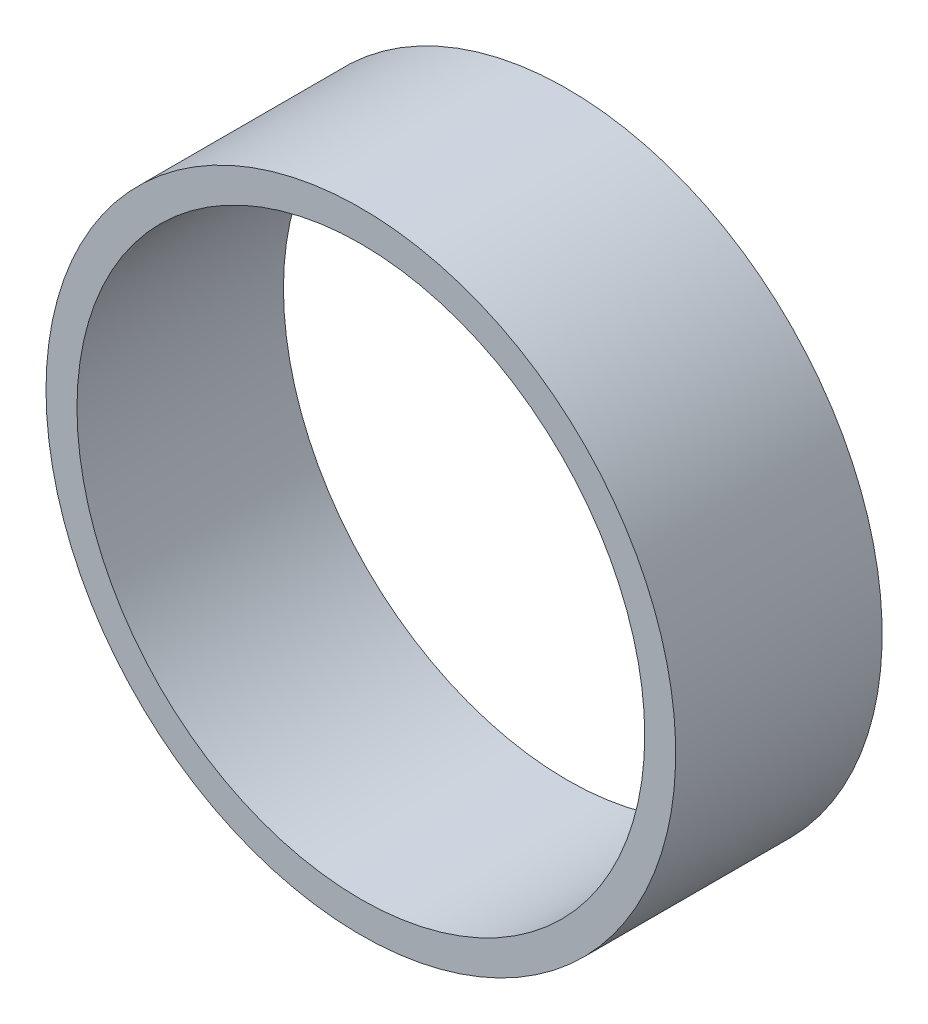
ISO-10303-21;
HEADER;
FILE_DESCRIPTION(('STEP AP214'),'2;1');
FILE_NAME('part.step','',(''),(''),'','','');
FILE_SCHEMA(('AUTOMOTIVE_DESIGN { 1 0 10303 214 1 1 1 1 }'));
ENDSEC;
DATA;
#1=APPLICATION_CONTEXT('core data for automotive mechanical design processes');
#2=APPLICATION_PROTOCOL_DEFINITION('international standard','automotive_design',2000,#1);
#3=PRODUCT_CONTEXT('',#1,'mechanical');
#4=PRODUCT('Part','Part','',(#3));
#5=PRODUCT_RELATED_PRODUCT_CATEGORY('part','',(#4));
#6=PRODUCT_DEFINITION_FORMATION('','',#4);
#7=PRODUCT_DEFINITION_CONTEXT('part definition',#1,'design');
#8=PRODUCT_DEFINITION('design','',#6,#7);
#9=PRODUCT_DEFINITION_SHAPE('','',#8);
#10=(LENGTH_UNIT() NAMED_UNIT(*) SI_UNIT(.MILLI.,.METRE.));
#11=(NAMED_UNIT(*) PLANE_ANGLE_UNIT() SI_UNIT($,.RADIAN.));
#12=(NAMED_UNIT(*) SI_UNIT($,.STERADIAN.) SOLID_ANGLE_UNIT());
#13=UNCERTAINTY_MEASURE_WITH_UNIT(LENGTH_MEASURE(1.E-05),#10,'distance_accuracy_value','');
#14=(GEOMETRIC_REPRESENTATION_CONTEXT(3) GLOBAL_UNCERTAINTY_ASSIGNED_CONTEXT((#13)) GLOBAL_UNIT_ASSIGNED_CONTEXT((#10,
#11,#12)) REPRESENTATION_CONTEXT('',''));
#15=CARTESIAN_POINT('',(0.,0.,0.));
#16=DIRECTION('',(0.,0.,1.));
#17=DIRECTION('',(1.,0.,0.));
#18=AXIS2_PLACEMENT_3D('',#15,#16,#17);
#19=CARTESIAN_POINT('',(0.,0.,20.));
#20=DIRECTION('',(0.,0.,0.999999999999998));
#21=DIRECTION('',(1.,0.,0.));
#22=AXIS2_PLACEMENT_3D('',#19,#20,#21);
#23=PLANE('',#22);
#24=CARTESIAN_POINT('',(0.,0.,20.));
#25=DIRECTION('',(0.,0.,0.999999999999998));
#26=DIRECTION('',(1.,0.,0.));
#27=AXIS2_PLACEMENT_3D('',#24,#25,#26);
#28=CIRCLE('',#27,30.5);
#29=CARTESIAN_POINT('',(-30.5000000000001,0.,20.));
#30=VERTEX_POINT('',#29);
#31=EDGE_CURVE('E12',#30,#30,#28,.T.);
#32=ORIENTED_EDGE('',*,*,#31,.T.);
#33=EDGE_LOOP('',(#32));
#34=FACE_BOUND('',#33,.T.);
#35=CARTESIAN_POINT('',(0.,0.,20.));
#36=DIRECTION('',(0.,0.,0.999999999999998));
#37=DIRECTION('',(1.,0.,0.));
#38=AXIS2_PLACEMENT_3D('',#35,#36,#37);
#39=CIRCLE('',#38,27.5);
#40=CARTESIAN_POINT('',(-27.5000000000001,0.,20.));
#41=VERTEX_POINT('',#40);
#42=EDGE_CURVE('E56',#41,#41,#39,.T.);
#43=ORIENTED_EDGE('',*,*,#42,.F.);
#44=EDGE_LOOP('',(#43));
#45=FACE_BOUND('',#44,.T.);
#46=ADVANCED_FACE('F45',(#34,#45),#23,.T.);
#47=CARTESIAN_POINT('',(0.,0.,0.));
#48=DIRECTION('',(0.,0.,0.999999999999998));
#49=DIRECTION('',(1.,0.,0.));
#50=AXIS2_PLACEMENT_3D('',#47,#48,#49);
#51=PLANE('',#50);
#52=CARTESIAN_POINT('',(0.,0.,0.));
#53=DIRECTION('',(0.,0.,0.999999999999998));
#54=DIRECTION('',(1.,0.,0.));
#55=AXIS2_PLACEMENT_3D('',#52,#53,#54);
#56=CIRCLE('',#55,30.5);
#57=CARTESIAN_POINT('',(-30.5000000000001,0.,0.));
#58=VERTEX_POINT('',#57);
#59=EDGE_CURVE('E49',#58,#58,#56,.T.);
#60=ORIENTED_EDGE('',*,*,#59,.F.);
#61=EDGE_LOOP('',(#60));
#62=FACE_BOUND('',#61,.T.);
#63=CARTESIAN_POINT('',(0.,0.,0.));
#64=DIRECTION('',(0.,0.,0.999999999999998));
#65=DIRECTION('',(1.,0.,0.));
#66=AXIS2_PLACEMENT_3D('',#63,#64,#65);
#67=CIRCLE('',#66,27.5);
#68=CARTESIAN_POINT('',(-27.5000000000001,0.,0.));
#69=VERTEX_POINT('',#68);
#70=EDGE_CURVE('E58',#69,#69,#67,.T.);
#71=ORIENTED_EDGE('',*,*,#70,.T.);
#72=EDGE_LOOP('',(#71));
#73=FACE_BOUND('',#72,.T.);
#74=ADVANCED_FACE('F68',(#62,#73),#51,.F.);
#75=CARTESIAN_POINT('',(0.,0.,20.));
#76=DIRECTION('',(0.,0.,-0.999999999999998));
#77=DIRECTION('',(-1.,0.,0.));
#78=AXIS2_PLACEMENT_3D('',#75,#76,#77);
#79=CYLINDRICAL_SURFACE('',#78,30.5);
#80=CARTESIAN_POINT('',(-30.5000000000001,0.,20.));
#81=CARTESIAN_POINT('',(-30.5000000000001,0.,19.7916666666667));
#82=CARTESIAN_POINT('',(-30.5000000000001,0.,19.5833333333333));
#83=CARTESIAN_POINT('',(-30.5000000000001,0.,19.1666666666667));
#84=CARTESIAN_POINT('',(-30.5000000000001,0.,18.9583333333333));
#85=CARTESIAN_POINT('',(-30.5000000000001,0.,18.5416666666667));
#86=CARTESIAN_POINT('',(-30.5000000000001,0.,18.3333333333333));
#87=CARTESIAN_POINT('',(-30.5000000000001,0.,17.9166666666667));
#88=CARTESIAN_POINT('',(-30.5000000000001,0.,17.7083333333333));
#89=CARTESIAN_POINT('',(-30.5000000000001,0.,17.2916666666667));
#90=CARTESIAN_POINT('',(-30.5000000000001,0.,17.0833333333333));
#91=CARTESIAN_POINT('',(-30.5000000000001,0.,16.6666666666667));
#92=CARTESIAN_POINT('',(-30.5000000000001,0.,16.4583333333333));
#93=CARTESIAN_POINT('',(-30.5000000000001,0.,16.0416666666667));
#94=CARTESIAN_POINT('',(-30.5000000000001,0.,15.8333333333333));
#95=CARTESIAN_POINT('',(-30.5000000000001,0.,15.4166666666667));
#96=CARTESIAN_POINT('',(-30.5000000000001,0.,15.2083333333333));
#97=CARTESIAN_POINT('',(-30.5000000000001,0.,14.7916666666667));
#98=CARTESIAN_POINT('',(-30.5000000000001,0.,14.5833333333333));
#99=CARTESIAN_POINT('',(-30.5000000000001,0.,14.1666666666667));
#100=CARTESIAN_POINT('',(-30.5000000000001,0.,13.9583333333333));
#101=CARTESIAN_POINT('',(-30.5000000000001,0.,13.5416666666667));
#102=CARTESIAN_POINT('',(-30.5000000000001,0.,13.3333333333333));
#103=CARTESIAN_POINT('',(-30.5000000000001,0.,12.9166666666667));
#104=CARTESIAN_POINT('',(-30.5000000000001,0.,12.7083333333333));
#105=CARTESIAN_POINT('',(-30.5000000000001,0.,12.2916666666667));
#106=CARTESIAN_POINT('',(-30.5000000000001,0.,12.0833333333333));
#107=CARTESIAN_POINT('',(-30.5000000000001,0.,11.6666666666667));
#108=CARTESIAN_POINT('',(-30.5000000000001,0.,11.4583333333333));
#109=CARTESIAN_POINT('',(-30.5000000000001,0.,11.0416666666667));
#110=CARTESIAN_POINT('',(-30.5000000000001,0.,10.8333333333333));
#111=CARTESIAN_POINT('',(-30.5000000000001,0.,10.4166666666667));
#112=CARTESIAN_POINT('',(-30.5000000000001,0.,10.2083333333333));
#113=CARTESIAN_POINT('',(-30.5000000000001,0.,9.79166666666666));
#114=CARTESIAN_POINT('',(-30.5000000000001,0.,9.58333333333333));
#115=CARTESIAN_POINT('',(-30.5000000000001,0.,9.16666666666666));
#116=CARTESIAN_POINT('',(-30.5000000000001,0.,8.95833333333333));
#117=CARTESIAN_POINT('',(-30.5000000000001,0.,8.54166666666666));
#118=CARTESIAN_POINT('',(-30.5000000000001,0.,8.33333333333333));
#119=CARTESIAN_POINT('',(-30.5000000000001,0.,7.91666666666666));
#120=CARTESIAN_POINT('',(-30.5000000000001,0.,7.70833333333333));
#121=CARTESIAN_POINT('',(-30.5000000000001,0.,7.29166666666666));
#122=CARTESIAN_POINT('',(-30.5000000000001,0.,7.08333333333333));
#123=CARTESIAN_POINT('',(-30.5000000000001,0.,6.66666666666666));
#124=CARTESIAN_POINT('',(-30.5000000000001,0.,6.45833333333333));
#125=CARTESIAN_POINT('',(-30.5000000000001,0.,6.04166666666666));
#126=CARTESIAN_POINT('',(-30.5000000000001,0.,5.83333333333333));
#127=CARTESIAN_POINT('',(-30.5000000000001,0.,5.41666666666666));
#128=CARTESIAN_POINT('',(-30.5000000000001,0.,5.20833333333333));
#129=CARTESIAN_POINT('',(-30.5000000000001,0.,4.79166666666666));
#130=CARTESIAN_POINT('',(-30.5000000000001,0.,4.58333333333333));
#131=CARTESIAN_POINT('',(-30.5000000000001,0.,4.16666666666666));
#132=CARTESIAN_POINT('',(-30.5000000000001,0.,3.95833333333333));
#133=CARTESIAN_POINT('',(-30.5000000000001,0.,3.54166666666666));
#134=CARTESIAN_POINT('',(-30.5000000000001,0.,3.33333333333333));
#135=CARTESIAN_POINT('',(-30.5000000000001,0.,2.91666666666666));
#136=CARTESIAN_POINT('',(-30.5000000000001,0.,2.70833333333333));
#137=CARTESIAN_POINT('',(-30.5000000000001,0.,2.29166666666666));
#138=CARTESIAN_POINT('',(-30.5000000000001,0.,2.08333333333333));
#139=CARTESIAN_POINT('',(-30.5000000000001,0.,1.66666666666666));
#140=CARTESIAN_POINT('',(-30.5000000000001,0.,1.45833333333333));
#141=CARTESIAN_POINT('',(-30.5000000000001,0.,1.04166666666666));
#142=CARTESIAN_POINT('',(-30.5000000000001,0.,0.833333333333331));
#143=CARTESIAN_POINT('',(-30.5000000000001,0.,0.416666666666665));
#144=CARTESIAN_POINT('',(-30.5000000000001,0.,0.208333333333333));
#145=CARTESIAN_POINT('',(-30.5000000000001,0.,0.));
#146=B_SPLINE_CURVE_WITH_KNOTS('',3,(#80,#81,#82,#83,#84,#85,#86,#87,#88,#89,#90,#91,#92,#93,
#94,#95,#96,#97,#98,#99,#100,#101,#102,#103,#104,#105,#106,#107,#108,#109,#110,#111,#112,#113,
#114,#115,#116,#117,#118,#119,#120,#121,#122,#123,#124,#125,#126,#127,#128,#129,#130,#131,#132,
#133,#134,#135,#136,#137,#138,#139,#140,#141,#142,#143,#144,#145),.UNSPECIFIED.,.F.,.F.,(4,2,2,
2,2,2,2,2,2,2,2,2,2,2,2,2,2,2,2,2,2,2,2,2,2,2,2,2,2,2,2,2,4),(0.,0.624999999999997,1.25,1.875,
2.5,3.125,3.75,4.375,4.99999999999999,5.62499999999999,6.25,6.87499999999999,7.49999999999999,
8.12499999999999,8.74999999999999,9.37499999999999,9.99999999999999,10.625,11.25,11.875,12.5,
13.125,13.75,14.375,15.,15.625,16.25,16.875,17.5,18.125,18.75,19.375,20.),.UNSPECIFIED.);
#147=EDGE_CURVE('BSEAM47',#30,#58,#146,.T.);
#148=ORIENTED_EDGE('',*,*,#31,.F.);
#149=ORIENTED_EDGE('',*,*,#59,.T.);
#150=ORIENTED_EDGE('',*,*,#147,.T.);
#151=ORIENTED_EDGE('',*,*,#147,.F.);
#152=EDGE_LOOP('',(#148,#150,#149,#151));
#153=FACE_BOUND('',#152,.T.);
#154=ADVANCED_FACE('F47',(#153),#79,.T.);
#155=CARTESIAN_POINT('',(0.,0.,20.));
#156=DIRECTION('',(0.,0.,-0.999999999999998));
#157=DIRECTION('',(-1.,0.,0.));
#158=AXIS2_PLACEMENT_3D('',#155,#156,#157);
#159=CYLINDRICAL_SURFACE('',#158,27.5);
#160=CARTESIAN_POINT('',(-27.5000000000001,0.,20.));
#161=CARTESIAN_POINT('',(-27.5000000000001,0.,19.7916666666667));
#162=CARTESIAN_POINT('',(-27.5000000000001,0.,19.5833333333333));
#163=CARTESIAN_POINT('',(-27.5000000000001,0.,19.1666666666667));
#164=CARTESIAN_POINT('',(-27.5000000000001,0.,18.9583333333333));
#165=CARTESIAN_POINT('',(-27.5000000000001,0.,18.5416666666667));
#166=CARTESIAN_POINT('',(-27.5000000000001,0.,18.3333333333333));
#167=CARTESIAN_POINT('',(-27.5000000000001,0.,17.9166666666667));
#168=CARTESIAN_POINT('',(-27.5000000000001,0.,17.7083333333333));
#169=CARTESIAN_POINT('',(-27.5000000000001,0.,17.2916666666667));
#170=CARTESIAN_POINT('',(-27.5000000000001,0.,17.0833333333333));
#171=CARTESIAN_POINT('',(-27.5000000000001,0.,16.6666666666667));
#172=CARTESIAN_POINT('',(-27.5000000000001,0.,16.4583333333333));
#173=CARTESIAN_POINT('',(-27.5000000000001,0.,16.0416666666667));
#174=CARTESIAN_POINT('',(-27.5000000000001,0.,15.8333333333333));
#175=CARTESIAN_POINT('',(-27.5000000000001,0.,15.4166666666667));
#176=CARTESIAN_POINT('',(-27.5000000000001,0.,15.2083333333333));
#177=CARTESIAN_POINT('',(-27.5000000000001,0.,14.7916666666667));
#178=CARTESIAN_POINT('',(-27.5000000000001,0.,14.5833333333333));
#179=CARTESIAN_POINT('',(-27.5000000000001,0.,14.1666666666667));
#180=CARTESIAN_POINT('',(-27.5000000000001,0.,13.9583333333333));
#181=CARTESIAN_POINT('',(-27.5000000000001,0.,13.5416666666667));
#182=CARTESIAN_POINT('',(-27.5000000000001,0.,13.3333333333333));
#183=CARTESIAN_POINT('',(-27.5000000000001,0.,12.9166666666667));
#184=CARTESIAN_POINT('',(-27.5000000000001,0.,12.7083333333333));
#185=CARTESIAN_POINT('',(-27.5000000000001,0.,12.2916666666667));
#186=CARTESIAN_POINT('',(-27.5000000000001,0.,12.0833333333333));
#187=CARTESIAN_POINT('',(-27.5000000000001,0.,11.6666666666667));
#188=CARTESIAN_POINT('',(-27.5000000000001,0.,11.4583333333333));
#189=CARTESIAN_POINT('',(-27.5000000000001,0.,11.0416666666667));
#190=CARTESIAN_POINT('',(-27.5000000000001,0.,10.8333333333333));
#191=CARTESIAN_POINT('',(-27.5000000000001,0.,10.4166666666667));
#192=CARTESIAN_POINT('',(-27.5000000000001,0.,10.2083333333333));
#193=CARTESIAN_POINT('',(-27.5000000000001,0.,9.79166666666666));
#194=CARTESIAN_POINT('',(-27.5000000000001,0.,9.58333333333333));
#195=CARTESIAN_POINT('',(-27.5000000000001,0.,9.16666666666666));
#196=CARTESIAN_POINT('',(-27.5000000000001,0.,8.95833333333333));
#197=CARTESIAN_POINT('',(-27.5000000000001,0.,8.54166666666666));
#198=CARTESIAN_POINT('',(-27.5000000000001,0.,8.33333333333333));
#199=CARTESIAN_POINT('',(-27.5000000000001,0.,7.91666666666666));
#200=CARTESIAN_POINT('',(-27.5000000000001,0.,7.70833333333333));
#201=CARTESIAN_POINT('',(-27.5000000000001,0.,7.29166666666666));
#202=CARTESIAN_POINT('',(-27.5000000000001,0.,7.08333333333333));
#203=CARTESIAN_POINT('',(-27.5000000000001,0.,6.66666666666666));
#204=CARTESIAN_POINT('',(-27.5000000000001,0.,6.45833333333333));
#205=CARTESIAN_POINT('',(-27.5000000000001,0.,6.04166666666666));
#206=CARTESIAN_POINT('',(-27.5000000000001,0.,5.83333333333333));
#207=CARTESIAN_POINT('',(-27.5000000000001,0.,5.41666666666666));
#208=CARTESIAN_POINT('',(-27.5000000000001,0.,5.20833333333333));
#209=CARTESIAN_POINT('',(-27.5000000000001,0.,4.79166666666666));
#210=CARTESIAN_POINT('',(-27.5000000000001,0.,4.58333333333333));
#211=CARTESIAN_POINT('',(-27.5000000000001,0.,4.16666666666666));
#212=CARTESIAN_POINT('',(-27.5000000000001,0.,3.95833333333333));
#213=CARTESIAN_POINT('',(-27.5000000000001,0.,3.54166666666666));
#214=CARTESIAN_POINT('',(-27.5000000000001,0.,3.33333333333333));
#215=CARTESIAN_POINT('',(-27.5000000000001,0.,2.91666666666666));
#216=CARTESIAN_POINT('',(-27.5000000000001,0.,2.70833333333333));
#217=CARTESIAN_POINT('',(-27.5000000000001,0.,2.29166666666666));
#218=CARTESIAN_POINT('',(-27.5000000000001,0.,2.08333333333333));
#219=CARTESIAN_POINT('',(-27.5000000000001,0.,1.66666666666666));
#220=CARTESIAN_POINT('',(-27.5000000000001,0.,1.45833333333333));
#221=CARTESIAN_POINT('',(-27.5000000000001,0.,1.04166666666666));
#222=CARTESIAN_POINT('',(-27.5000000000001,0.,0.833333333333331));
#223=CARTESIAN_POINT('',(-27.5000000000001,0.,0.416666666666665));
#224=CARTESIAN_POINT('',(-27.5000000000001,0.,0.208333333333333));
#225=CARTESIAN_POINT('',(-27.5000000000001,0.,0.));
#226=B_SPLINE_CURVE_WITH_KNOTS('',3,(#160,#161,#162,#163,#164,#165,#166,#167,#168,#169,#170,
#171,#172,#173,#174,#175,#176,#177,#178,#179,#180,#181,#182,#183,#184,#185,#186,#187,#188,#189,
#190,#191,#192,#193,#194,#195,#196,#197,#198,#199,#200,#201,#202,#203,#204,#205,#206,#207,#208,
#209,#210,#211,#212,#213,#214,#215,#216,#217,#218,#219,#220,#221,#222,#223,#224,#225),
.UNSPECIFIED.,.F.,.F.,(4,2,2,2,2,2,2,2,2,2,2,2,2,2,2,2,2,2,2,2,2,2,2,2,2,2,2,2,2,2,2,2,4),(0.,
0.624999999999997,1.25,1.875,2.5,3.125,3.75,4.375,4.99999999999999,5.62499999999999,6.25,
6.87499999999999,7.49999999999999,8.12499999999999,8.74999999999999,9.37499999999999,
9.99999999999999,10.625,11.25,11.875,12.5,13.125,13.75,14.375,15.,15.625,16.25,16.875,17.5,
18.125,18.75,19.375,20.),.UNSPECIFIED.);
#227=EDGE_CURVE('BSEAM64',#41,#69,#226,.T.);
#228=ORIENTED_EDGE('',*,*,#42,.T.);
#229=ORIENTED_EDGE('',*,*,#70,.F.);
#230=ORIENTED_EDGE('',*,*,#227,.T.);
#231=ORIENTED_EDGE('',*,*,#227,.F.);
#232=EDGE_LOOP('',(#228,#230,#229,#231));
#233=FACE_BOUND('',#232,.T.);
#234=ADVANCED_FACE('F64',(#233),#159,.F.);
#235=CLOSED_SHELL('',(#46,#74,#154,#234));
#236=MANIFOLD_SOLID_BREP('B2',#235);
#237=ADVANCED_BREP_SHAPE_REPRESENTATION('',(#18,#236),#14);
#238=SHAPE_DEFINITION_REPRESENTATION(#9,#237);
ENDSEC;
END-ISO-10303-21;
